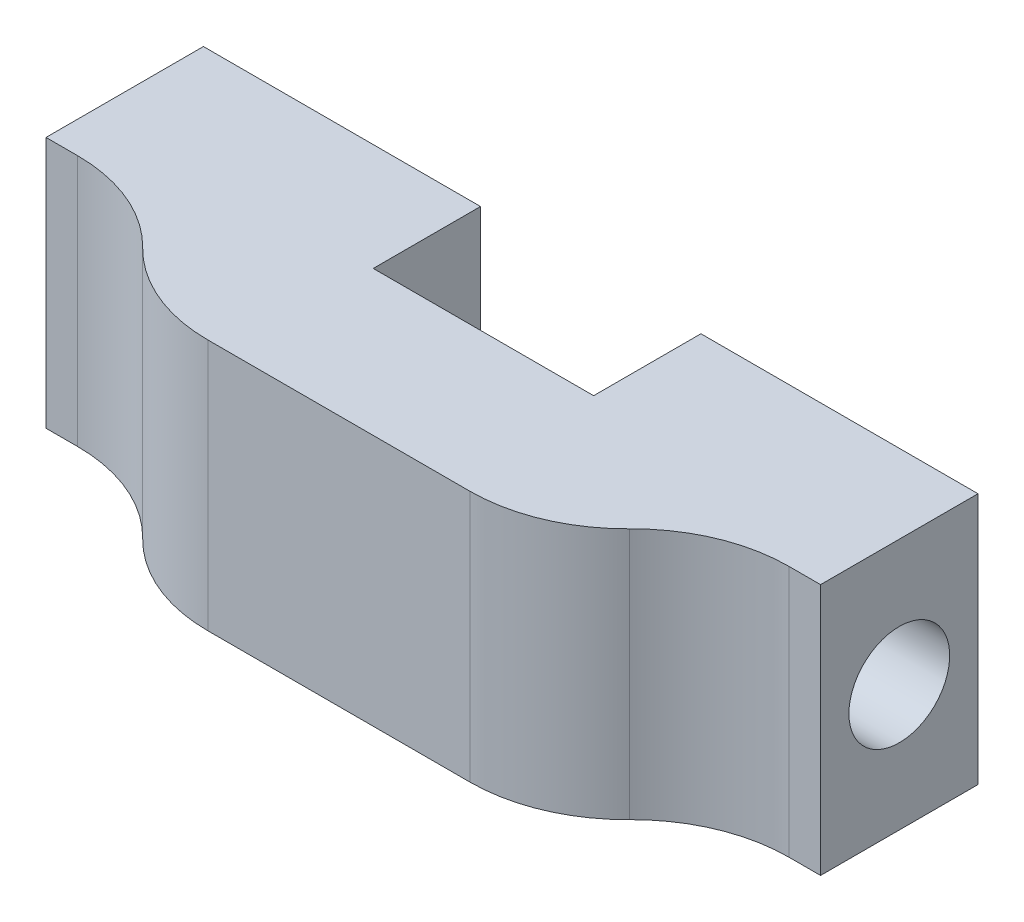
ISO-10303-21;
HEADER;
FILE_DESCRIPTION(('STEP AP214'),'2;1');
FILE_NAME('part.step','',(''),(''),'','','');
FILE_SCHEMA(('AUTOMOTIVE_DESIGN { 1 0 10303 214 1 1 1 1 }'));
ENDSEC;
DATA;
#1=APPLICATION_CONTEXT('core data for automotive mechanical design processes');
#2=APPLICATION_PROTOCOL_DEFINITION('international standard','automotive_design',2000,#1);
#3=PRODUCT_CONTEXT('',#1,'mechanical');
#4=PRODUCT('Part','Part','',(#3));
#5=PRODUCT_RELATED_PRODUCT_CATEGORY('part','',(#4));
#6=PRODUCT_DEFINITION_FORMATION('','',#4);
#7=PRODUCT_DEFINITION_CONTEXT('part definition',#1,'design');
#8=PRODUCT_DEFINITION('design','',#6,#7);
#9=PRODUCT_DEFINITION_SHAPE('','',#8);
#10=(LENGTH_UNIT() NAMED_UNIT(*) SI_UNIT(.MILLI.,.METRE.));
#11=(NAMED_UNIT(*) PLANE_ANGLE_UNIT() SI_UNIT($,.RADIAN.));
#12=(NAMED_UNIT(*) SI_UNIT($,.STERADIAN.) SOLID_ANGLE_UNIT());
#13=UNCERTAINTY_MEASURE_WITH_UNIT(LENGTH_MEASURE(1.E-05),#10,'distance_accuracy_value','');
#14=(GEOMETRIC_REPRESENTATION_CONTEXT(3) GLOBAL_UNCERTAINTY_ASSIGNED_CONTEXT((#13)) GLOBAL_UNIT_ASSIGNED_CONTEXT((#10,
#11,#12)) REPRESENTATION_CONTEXT('',''));
#15=CARTESIAN_POINT('',(0.,0.,0.));
#16=DIRECTION('',(0.,0.,1.));
#17=DIRECTION('',(1.,0.,0.));
#18=AXIS2_PLACEMENT_3D('',#15,#16,#17);
#19=CARTESIAN_POINT('',(4.15857157145715,4.,2.99999999999946));
#20=DIRECTION('',(0.,-1.,0.));
#21=DIRECTION('',(0.,0.,-1.));
#22=AXIS2_PLACEMENT_3D('',#19,#20,#21);
#23=CYLINDRICAL_SURFACE('',#22,5.);
#24=CARTESIAN_POINT('',(4.15857157145715,-4.,2.99999999999946));
#25=DIRECTION('',(0.,1.,0.));
#26=DIRECTION('',(0.,0.,1.));
#27=AXIS2_PLACEMENT_3D('',#24,#25,#26);
#28=CIRCLE('',#27,5.);
#29=CARTESIAN_POINT('',(4.15857157145716,-4.,7.99999999999945));
#30=VERTEX_POINT('',#29);
#31=CARTESIAN_POINT('',(7.72928578572858,-4.,6.49999999999946));
#32=VERTEX_POINT('',#31);
#33=EDGE_CURVE('E242',#30,#32,#28,.T.);
#34=ORIENTED_EDGE('',*,*,#33,.T.);
#35=DIRECTION('',(0.,-1.,0.));
#36=VECTOR('',#35,1.);
#37=CARTESIAN_POINT('',(7.72928578572858,4.,6.49999999999946));
#38=LINE('',#37,#36);
#39=CARTESIAN_POINT('',(7.72928578572858,4.,6.49999999999946));
#40=VERTEX_POINT('',#39);
#41=EDGE_CURVE('E48',#40,#32,#38,.T.);
#42=ORIENTED_EDGE('',*,*,#41,.F.);
#43=CARTESIAN_POINT('',(4.15857157145715,4.,2.99999999999946));
#44=DIRECTION('',(0.,1.,0.));
#45=DIRECTION('',(0.,0.,1.));
#46=AXIS2_PLACEMENT_3D('',#43,#44,#45);
#47=CIRCLE('',#46,5.);
#48=CARTESIAN_POINT('',(4.15857157145716,4.,7.99999999999945));
#49=VERTEX_POINT('',#48);
#50=EDGE_CURVE('E215',#49,#40,#47,.T.);
#51=ORIENTED_EDGE('',*,*,#50,.F.);
#52=DIRECTION('',(0.,-1.,0.));
#53=VECTOR('',#52,1.);
#54=CARTESIAN_POINT('',(4.15857157145716,4.,7.99999999999945));
#55=LINE('',#54,#53);
#56=EDGE_CURVE('E209',#49,#30,#55,.T.);
#57=ORIENTED_EDGE('',*,*,#56,.T.);
#58=EDGE_LOOP('',(#34,#42,#51,#57));
#59=FACE_BOUND('',#58,.T.);
#60=ADVANCED_FACE('F41',(#59),#23,.T.);
#61=CARTESIAN_POINT('',(11.3,4.,9.99999999999946));
#62=DIRECTION('',(0.,-1.,0.));
#63=DIRECTION('',(0.,0.,-1.));
#64=AXIS2_PLACEMENT_3D('',#61,#62,#63);
#65=CYLINDRICAL_SURFACE('',#64,5.00000000000001);
#66=CARTESIAN_POINT('',(11.3,-4.,9.99999999999946));
#67=DIRECTION('',(0.,1.,0.));
#68=DIRECTION('',(0.,0.,1.));
#69=AXIS2_PLACEMENT_3D('',#66,#67,#68);
#70=CIRCLE('',#69,5.00000000000001);
#71=CARTESIAN_POINT('',(11.3,-4.,4.99999999999945));
#72=VERTEX_POINT('',#71);
#73=EDGE_CURVE('E240',#32,#72,#70,.F.);
#74=ORIENTED_EDGE('',*,*,#73,.T.);
#75=DIRECTION('',(0.,-1.,0.));
#76=VECTOR('',#75,1.);
#77=CARTESIAN_POINT('',(11.3,4.,4.99999999999945));
#78=LINE('',#77,#76);
#79=CARTESIAN_POINT('',(11.3,4.,4.99999999999945));
#80=VERTEX_POINT('',#79);
#81=EDGE_CURVE('E310',#80,#72,#78,.T.);
#82=ORIENTED_EDGE('',*,*,#81,.F.);
#83=CARTESIAN_POINT('',(11.3,4.,9.99999999999946));
#84=DIRECTION('',(0.,1.,0.));
#85=DIRECTION('',(0.,0.,1.));
#86=AXIS2_PLACEMENT_3D('',#83,#84,#85);
#87=CIRCLE('',#86,5.00000000000001);
#88=EDGE_CURVE('E269',#40,#80,#87,.F.);
#89=ORIENTED_EDGE('',*,*,#88,.F.);
#90=ORIENTED_EDGE('',*,*,#41,.T.);
#91=EDGE_LOOP('',(#74,#82,#89,#90));
#92=FACE_BOUND('',#91,.T.);
#93=ADVANCED_FACE('F290',(#92),#65,.F.);
#94=CARTESIAN_POINT('',(0.,4.,4.99999999999945));
#95=DIRECTION('',(0.,0.,-1.));
#96=DIRECTION('',(-1.,0.,0.));
#97=AXIS2_PLACEMENT_3D('',#94,#95,#96);
#98=PLANE('',#97);
#99=DIRECTION('',(1.,0.,0.));
#100=VECTOR('',#99,1.);
#101=CARTESIAN_POINT('',(0.,-4.,4.99999999999945));
#102=LINE('',#101,#100);
#103=CARTESIAN_POINT('',(12.3,-4.,4.99999999999945));
#104=VERTEX_POINT('',#103);
#105=EDGE_CURVE('E238',#72,#104,#102,.T.);
#106=ORIENTED_EDGE('',*,*,#105,.T.);
#107=DIRECTION('',(0.,-1.,0.));
#108=VECTOR('',#107,1.);
#109=CARTESIAN_POINT('',(12.3,4.,4.99999999999945));
#110=LINE('',#109,#108);
#111=CARTESIAN_POINT('',(12.3,4.,4.99999999999945));
#112=VERTEX_POINT('',#111);
#113=EDGE_CURVE('E311',#112,#104,#110,.T.);
#114=ORIENTED_EDGE('',*,*,#113,.F.);
#115=DIRECTION('',(1.,0.,0.));
#116=VECTOR('',#115,1.);
#117=CARTESIAN_POINT('',(0.,4.,4.99999999999945));
#118=LINE('',#117,#116);
#119=EDGE_CURVE('E267',#80,#112,#118,.T.);
#120=ORIENTED_EDGE('',*,*,#119,.F.);
#121=ORIENTED_EDGE('',*,*,#81,.T.);
#122=EDGE_LOOP('',(#106,#114,#120,#121));
#123=FACE_BOUND('',#122,.T.);
#124=ADVANCED_FACE('F295',(#123),#98,.F.);
#125=CARTESIAN_POINT('',(12.3,4.,0.));
#126=DIRECTION('',(-1.,0.,0.));
#127=DIRECTION('',(0.,0.,1.));
#128=AXIS2_PLACEMENT_3D('',#125,#126,#127);
#129=PLANE('',#128);
#130=CARTESIAN_POINT('',(12.3,0.,2.49999999999972));
#131=DIRECTION('',(-1.,0.,0.));
#132=DIRECTION('',(0.,0.,1.));
#133=AXIS2_PLACEMENT_3D('',#130,#131,#132);
#134=CIRCLE('',#133,1.6);
#135=CARTESIAN_POINT('',(12.3,0.,4.09999999999972));
#136=VERTEX_POINT('',#135);
#137=EDGE_CURVE('E171',#136,#136,#134,.T.);
#138=ORIENTED_EDGE('',*,*,#137,.T.);
#139=EDGE_LOOP('',(#138));
#140=FACE_BOUND('',#139,.T.);
#141=DIRECTION('',(0.,0.,-1.));
#142=VECTOR('',#141,1.);
#143=CARTESIAN_POINT('',(12.3,-4.,0.));
#144=LINE('',#143,#142);
#145=CARTESIAN_POINT('',(12.3,-4.,0.));
#146=VERTEX_POINT('',#145);
#147=EDGE_CURVE('E236',#104,#146,#144,.T.);
#148=ORIENTED_EDGE('',*,*,#147,.T.);
#149=DIRECTION('',(0.,-1.,0.));
#150=VECTOR('',#149,1.);
#151=CARTESIAN_POINT('',(12.3,4.,0.));
#152=LINE('',#151,#150);
#153=CARTESIAN_POINT('',(12.3,4.,0.));
#154=VERTEX_POINT('',#153);
#155=EDGE_CURVE('E178',#154,#146,#152,.T.);
#156=ORIENTED_EDGE('',*,*,#155,.F.);
#157=DIRECTION('',(0.,0.,-1.));
#158=VECTOR('',#157,1.);
#159=CARTESIAN_POINT('',(12.3,4.,0.));
#160=LINE('',#159,#158);
#161=EDGE_CURVE('E265',#112,#154,#160,.T.);
#162=ORIENTED_EDGE('',*,*,#161,.F.);
#163=ORIENTED_EDGE('',*,*,#113,.T.);
#164=EDGE_LOOP('',(#148,#156,#162,#163));
#165=FACE_BOUND('',#164,.T.);
#166=ADVANCED_FACE('F280',(#140,#165),#129,.F.);
#167=CARTESIAN_POINT('',(0.,4.,0.));
#168=DIRECTION('',(0.,0.,1.));
#169=DIRECTION('',(1.,0.,0.));
#170=AXIS2_PLACEMENT_3D('',#167,#168,#169);
#171=PLANE('',#170);
#172=DIRECTION('',(-1.,0.,0.));
#173=VECTOR('',#172,1.);
#174=CARTESIAN_POINT('',(0.,-4.,0.));
#175=LINE('',#174,#173);
#176=CARTESIAN_POINT('',(3.5,-4.,0.));
#177=VERTEX_POINT('',#176);
#178=EDGE_CURVE('E234',#146,#177,#175,.T.);
#179=ORIENTED_EDGE('',*,*,#178,.T.);
#180=DIRECTION('',(0.,-1.,0.));
#181=VECTOR('',#180,1.);
#182=CARTESIAN_POINT('',(3.5,4.,0.));
#183=LINE('',#182,#181);
#184=CARTESIAN_POINT('',(3.5,4.,0.));
#185=VERTEX_POINT('',#184);
#186=EDGE_CURVE('E176',#185,#177,#183,.T.);
#187=ORIENTED_EDGE('',*,*,#186,.F.);
#188=DIRECTION('',(-1.,0.,0.));
#189=VECTOR('',#188,1.);
#190=CARTESIAN_POINT('',(0.,4.,0.));
#191=LINE('',#190,#189);
#192=EDGE_CURVE('E263',#154,#185,#191,.T.);
#193=ORIENTED_EDGE('',*,*,#192,.F.);
#194=ORIENTED_EDGE('',*,*,#155,.T.);
#195=EDGE_LOOP('',(#179,#187,#193,#194));
#196=FACE_BOUND('',#195,.T.);
#197=ADVANCED_FACE('F321',(#196),#171,.F.);
#198=CARTESIAN_POINT('',(3.5,4.,0.));
#199=DIRECTION('',(1.,0.,0.));
#200=DIRECTION('',(0.,0.,-1.));
#201=AXIS2_PLACEMENT_3D('',#198,#199,#200);
#202=PLANE('',#201);
#203=DIRECTION('',(0.,-1.,0.));
#204=VECTOR('',#203,1.);
#205=CARTESIAN_POINT('',(3.5,4.,3.40719730754273));
#206=LINE('',#205,#204);
#207=CARTESIAN_POINT('',(3.5,-1.31795031969597,3.40719730754273));
#208=VERTEX_POINT('',#207);
#209=CARTESIAN_POINT('',(3.5,-4.,3.40719730754273));
#210=VERTEX_POINT('',#209);
#211=EDGE_CURVE('E160',#208,#210,#206,.T.);
#212=ORIENTED_EDGE('',*,*,#211,.F.);
#213=CARTESIAN_POINT('',(3.5,0.,2.49999999999972));
#214=DIRECTION('',(-1.,0.,0.));
#215=DIRECTION('',(0.,0.,1.));
#216=AXIS2_PLACEMENT_3D('',#213,#214,#215);
#217=CIRCLE('',#216,1.6);
#218=CARTESIAN_POINT('',(3.5,1.31795031969597,3.40719730754273));
#219=VERTEX_POINT('',#218);
#220=EDGE_CURVE('E54',#219,#208,#217,.T.);
#221=ORIENTED_EDGE('',*,*,#220,.F.);
#222=CARTESIAN_POINT('',(3.5,4.,3.40719730754273));
#223=VERTEX_POINT('',#222);
#224=EDGE_CURVE('E159',#223,#219,#206,.T.);
#225=ORIENTED_EDGE('',*,*,#224,.F.);
#226=DIRECTION('',(0.,0.,1.));
#227=VECTOR('',#226,1.);
#228=CARTESIAN_POINT('',(3.5,4.,0.));
#229=LINE('',#228,#227);
#230=EDGE_CURVE('E261',#185,#223,#229,.T.);
#231=ORIENTED_EDGE('',*,*,#230,.F.);
#232=ORIENTED_EDGE('',*,*,#186,.T.);
#233=DIRECTION('',(0.,0.,1.));
#234=VECTOR('',#233,1.);
#235=CARTESIAN_POINT('',(3.5,-4.,0.));
#236=LINE('',#235,#234);
#237=EDGE_CURVE('E232',#177,#210,#236,.T.);
#238=ORIENTED_EDGE('',*,*,#237,.T.);
#239=EDGE_LOOP('',(#212,#221,#225,#231,#232,#238));
#240=FACE_BOUND('',#239,.T.);
#241=ADVANCED_FACE('F167',(#240),#202,.F.);
#242=CARTESIAN_POINT('',(0.,4.,3.40719730754273));
#243=DIRECTION('',(0.,0.,1.));
#244=DIRECTION('',(1.,0.,0.));
#245=AXIS2_PLACEMENT_3D('',#242,#243,#244);
#246=PLANE('',#245);
#247=DIRECTION('',(-1.,0.,0.));
#248=VECTOR('',#247,1.);
#249=CARTESIAN_POINT('',(0.,-4.,3.40719730754273));
#250=LINE('',#249,#248);
#251=CARTESIAN_POINT('',(-3.5,-4.,3.40719730754273));
#252=VERTEX_POINT('',#251);
#253=EDGE_CURVE('E230',#210,#252,#250,.T.);
#254=ORIENTED_EDGE('',*,*,#253,.T.);
#255=DIRECTION('',(0.,-1.,0.));
#256=VECTOR('',#255,1.);
#257=CARTESIAN_POINT('',(-3.5,4.,3.40719730754273));
#258=LINE('',#257,#256);
#259=CARTESIAN_POINT('',(-3.5,-1.31795031969597,3.40719730754273));
#260=VERTEX_POINT('',#259);
#261=EDGE_CURVE('E184',#260,#252,#258,.T.);
#262=ORIENTED_EDGE('',*,*,#261,.F.);
#263=CARTESIAN_POINT('',(-3.5,1.31795031969597,3.40719730754273));
#264=VERTEX_POINT('',#263);
#265=EDGE_CURVE('E183',#264,#260,#258,.T.);
#266=ORIENTED_EDGE('',*,*,#265,.F.);
#267=CARTESIAN_POINT('',(-3.5,4.,3.40719730754273));
#268=VERTEX_POINT('',#267);
#269=EDGE_CURVE('E181',#268,#264,#258,.T.);
#270=ORIENTED_EDGE('',*,*,#269,.F.);
#271=DIRECTION('',(-1.,0.,0.));
#272=VECTOR('',#271,1.);
#273=CARTESIAN_POINT('',(0.,4.,3.40719730754273));
#274=LINE('',#273,#272);
#275=EDGE_CURVE('E175',#223,#268,#274,.T.);
#276=ORIENTED_EDGE('',*,*,#275,.F.);
#277=ORIENTED_EDGE('',*,*,#224,.T.);
#278=EDGE_CURVE('E153',#219,#208,#206,.T.);
#279=ORIENTED_EDGE('',*,*,#278,.T.);
#280=ORIENTED_EDGE('',*,*,#211,.T.);
#281=EDGE_LOOP('',(#254,#262,#266,#270,#276,#277,#279,#280));
#282=FACE_BOUND('',#281,.T.);
#283=ADVANCED_FACE('F173',(#282),#246,.F.);
#284=CARTESIAN_POINT('',(-3.5,4.,0.));
#285=DIRECTION('',(-1.,0.,0.));
#286=DIRECTION('',(0.,0.,1.));
#287=AXIS2_PLACEMENT_3D('',#284,#285,#286);
#288=PLANE('',#287);
#289=ORIENTED_EDGE('',*,*,#269,.T.);
#290=CARTESIAN_POINT('',(-3.5,0.,2.49999999999972));
#291=DIRECTION('',(-1.,0.,0.));
#292=DIRECTION('',(0.,0.,1.));
#293=AXIS2_PLACEMENT_3D('',#290,#291,#292);
#294=CIRCLE('',#293,1.6);
#295=EDGE_CURVE('E11',#264,#260,#294,.T.);
#296=ORIENTED_EDGE('',*,*,#295,.T.);
#297=ORIENTED_EDGE('',*,*,#261,.T.);
#298=DIRECTION('',(0.,0.,-1.));
#299=VECTOR('',#298,1.);
#300=CARTESIAN_POINT('',(-3.5,-4.,0.));
#301=LINE('',#300,#299);
#302=CARTESIAN_POINT('',(-3.5,-4.,0.));
#303=VERTEX_POINT('',#302);
#304=EDGE_CURVE('E228',#252,#303,#301,.T.);
#305=ORIENTED_EDGE('',*,*,#304,.T.);
#306=DIRECTION('',(0.,-1.,0.));
#307=VECTOR('',#306,1.);
#308=CARTESIAN_POINT('',(-3.5,4.,0.));
#309=LINE('',#308,#307);
#310=CARTESIAN_POINT('',(-3.5,4.,0.));
#311=VERTEX_POINT('',#310);
#312=EDGE_CURVE('E188',#311,#303,#309,.T.);
#313=ORIENTED_EDGE('',*,*,#312,.F.);
#314=DIRECTION('',(0.,0.,-1.));
#315=VECTOR('',#314,1.);
#316=CARTESIAN_POINT('',(-3.5,4.,0.));
#317=LINE('',#316,#315);
#318=EDGE_CURVE('E258',#268,#311,#317,.T.);
#319=ORIENTED_EDGE('',*,*,#318,.F.);
#320=EDGE_LOOP('',(#289,#296,#297,#305,#313,#319));
#321=FACE_BOUND('',#320,.T.);
#322=ADVANCED_FACE('F345',(#321),#288,.F.);
#323=CARTESIAN_POINT('',(0.,4.,0.));
#324=DIRECTION('',(0.,0.,1.));
#325=DIRECTION('',(1.,0.,0.));
#326=AXIS2_PLACEMENT_3D('',#323,#324,#325);
#327=PLANE('',#326);
#328=DIRECTION('',(-1.,0.,0.));
#329=VECTOR('',#328,1.);
#330=CARTESIAN_POINT('',(0.,-4.,0.));
#331=LINE('',#330,#329);
#332=CARTESIAN_POINT('',(-12.3,-4.,0.));
#333=VERTEX_POINT('',#332);
#334=EDGE_CURVE('E226',#303,#333,#331,.T.);
#335=ORIENTED_EDGE('',*,*,#334,.T.);
#336=DIRECTION('',(0.,-1.,0.));
#337=VECTOR('',#336,1.);
#338=CARTESIAN_POINT('',(-12.3,4.,0.));
#339=LINE('',#338,#337);
#340=CARTESIAN_POINT('',(-12.3,4.,0.));
#341=VERTEX_POINT('',#340);
#342=EDGE_CURVE('E191',#341,#333,#339,.T.);
#343=ORIENTED_EDGE('',*,*,#342,.F.);
#344=DIRECTION('',(-1.,0.,0.));
#345=VECTOR('',#344,1.);
#346=CARTESIAN_POINT('',(0.,4.,0.));
#347=LINE('',#346,#345);
#348=EDGE_CURVE('E256',#311,#341,#347,.T.);
#349=ORIENTED_EDGE('',*,*,#348,.F.);
#350=ORIENTED_EDGE('',*,*,#312,.T.);
#351=EDGE_LOOP('',(#335,#343,#349,#350));
#352=FACE_BOUND('',#351,.T.);
#353=ADVANCED_FACE('F348',(#352),#327,.F.);
#354=CARTESIAN_POINT('',(-12.3,4.,0.));
#355=DIRECTION('',(-1.,0.,0.));
#356=DIRECTION('',(0.,0.,1.));
#357=AXIS2_PLACEMENT_3D('',#354,#355,#356);
#358=PLANE('',#357);
#359=CARTESIAN_POINT('',(-12.3,0.,2.49999999999972));
#360=DIRECTION('',(-1.,0.,0.));
#361=DIRECTION('',(0.,0.,1.));
#362=AXIS2_PLACEMENT_3D('',#359,#360,#361);
#363=CIRCLE('',#362,1.6);
#364=CARTESIAN_POINT('',(-12.3,0.,4.09999999999972));
#365=VERTEX_POINT('',#364);
#366=EDGE_CURVE('E274',#365,#365,#363,.T.);
#367=ORIENTED_EDGE('',*,*,#366,.F.);
#368=EDGE_LOOP('',(#367));
#369=FACE_BOUND('',#368,.T.);
#370=DIRECTION('',(0.,0.,-1.));
#371=VECTOR('',#370,1.);
#372=CARTESIAN_POINT('',(-12.3,-4.,0.));
#373=LINE('',#372,#371);
#374=CARTESIAN_POINT('',(-12.3,-4.,4.99999999999945));
#375=VERTEX_POINT('',#374);
#376=EDGE_CURVE('E223',#375,#333,#373,.T.);
#377=ORIENTED_EDGE('',*,*,#376,.F.);
#378=DIRECTION('',(0.,-1.,0.));
#379=VECTOR('',#378,1.);
#380=CARTESIAN_POINT('',(-12.3,4.,4.99999999999945));
#381=LINE('',#380,#379);
#382=CARTESIAN_POINT('',(-12.3,4.,4.99999999999945));
#383=VERTEX_POINT('',#382);
#384=EDGE_CURVE('E197',#383,#375,#381,.T.);
#385=ORIENTED_EDGE('',*,*,#384,.F.);
#386=DIRECTION('',(0.,0.,-1.));
#387=VECTOR('',#386,1.);
#388=CARTESIAN_POINT('',(-12.3,4.,0.));
#389=LINE('',#388,#387);
#390=EDGE_CURVE('E253',#383,#341,#389,.T.);
#391=ORIENTED_EDGE('',*,*,#390,.T.);
#392=ORIENTED_EDGE('',*,*,#342,.T.);
#393=EDGE_LOOP('',(#377,#385,#391,#392));
#394=FACE_BOUND('',#393,.T.);
#395=ADVANCED_FACE('F351',(#369,#394),#358,.T.);
#396=CARTESIAN_POINT('',(0.,4.,4.99999999999945));
#397=DIRECTION('',(0.,0.,1.));
#398=DIRECTION('',(1.,0.,0.));
#399=AXIS2_PLACEMENT_3D('',#396,#397,#398);
#400=PLANE('',#399);
#401=DIRECTION('',(-1.,0.,0.));
#402=VECTOR('',#401,1.);
#403=CARTESIAN_POINT('',(0.,-4.,4.99999999999945));
#404=LINE('',#403,#402);
#405=CARTESIAN_POINT('',(-11.3,-4.,4.99999999999945));
#406=VERTEX_POINT('',#405);
#407=EDGE_CURVE('E220',#406,#375,#404,.T.);
#408=ORIENTED_EDGE('',*,*,#407,.F.);
#409=DIRECTION('',(0.,-1.,0.));
#410=VECTOR('',#409,1.);
#411=CARTESIAN_POINT('',(-11.3,4.,4.99999999999945));
#412=LINE('',#411,#410);
#413=CARTESIAN_POINT('',(-11.3,4.,4.99999999999945));
#414=VERTEX_POINT('',#413);
#415=EDGE_CURVE('E201',#414,#406,#412,.T.);
#416=ORIENTED_EDGE('',*,*,#415,.F.);
#417=DIRECTION('',(-1.,0.,0.));
#418=VECTOR('',#417,1.);
#419=CARTESIAN_POINT('',(0.,4.,4.99999999999945));
#420=LINE('',#419,#418);
#421=EDGE_CURVE('E250',#414,#383,#420,.T.);
#422=ORIENTED_EDGE('',*,*,#421,.T.);
#423=ORIENTED_EDGE('',*,*,#384,.T.);
#424=EDGE_LOOP('',(#408,#416,#422,#423));
#425=FACE_BOUND('',#424,.T.);
#426=ADVANCED_FACE('F354',(#425),#400,.T.);
#427=CARTESIAN_POINT('',(-11.3,4.,9.99999999999946));
#428=DIRECTION('',(0.,-1.,0.));
#429=DIRECTION('',(0.,0.,-1.));
#430=AXIS2_PLACEMENT_3D('',#427,#428,#429);
#431=CYLINDRICAL_SURFACE('',#430,5.00000000000001);
#432=CARTESIAN_POINT('',(-11.3,-4.,9.99999999999946));
#433=DIRECTION('',(0.,1.,0.));
#434=DIRECTION('',(0.,0.,1.));
#435=AXIS2_PLACEMENT_3D('',#432,#433,#434);
#436=CIRCLE('',#435,5.00000000000001);
#437=CARTESIAN_POINT('',(-7.72928578572857,-4.,6.49999999999946));
#438=VERTEX_POINT('',#437);
#439=EDGE_CURVE('E218',#406,#438,#436,.F.);
#440=ORIENTED_EDGE('',*,*,#439,.T.);
#441=DIRECTION('',(0.,-1.,0.));
#442=VECTOR('',#441,1.);
#443=CARTESIAN_POINT('',(-7.72928578572857,4.,6.49999999999946));
#444=LINE('',#443,#442);
#445=CARTESIAN_POINT('',(-7.72928578572857,4.,6.49999999999946));
#446=VERTEX_POINT('',#445);
#447=EDGE_CURVE('E203',#446,#438,#444,.T.);
#448=ORIENTED_EDGE('',*,*,#447,.F.);
#449=CARTESIAN_POINT('',(-11.3,4.,9.99999999999946));
#450=DIRECTION('',(0.,1.,0.));
#451=DIRECTION('',(0.,0.,1.));
#452=AXIS2_PLACEMENT_3D('',#449,#450,#451);
#453=CIRCLE('',#452,5.00000000000001);
#454=EDGE_CURVE('E248',#414,#446,#453,.F.);
#455=ORIENTED_EDGE('',*,*,#454,.F.);
#456=ORIENTED_EDGE('',*,*,#415,.T.);
#457=EDGE_LOOP('',(#440,#448,#455,#456));
#458=FACE_BOUND('',#457,.T.);
#459=ADVANCED_FACE('F358',(#458),#431,.F.);
#460=CARTESIAN_POINT('',(-4.15857157145715,4.,2.99999999999946));
#461=DIRECTION('',(0.,-1.,0.));
#462=DIRECTION('',(0.,0.,-1.));
#463=AXIS2_PLACEMENT_3D('',#460,#461,#462);
#464=CYLINDRICAL_SURFACE('',#463,4.99999999999999);
#465=CARTESIAN_POINT('',(-4.15857157145715,-4.,2.99999999999946));
#466=DIRECTION('',(0.,1.,0.));
#467=DIRECTION('',(0.,0.,1.));
#468=AXIS2_PLACEMENT_3D('',#465,#466,#467);
#469=CIRCLE('',#468,4.99999999999999);
#470=CARTESIAN_POINT('',(-4.15857157145716,-4.,7.99999999999945));
#471=VERTEX_POINT('',#470);
#472=EDGE_CURVE('E216',#438,#471,#469,.T.);
#473=ORIENTED_EDGE('',*,*,#472,.T.);
#474=DIRECTION('',(0.,-1.,0.));
#475=VECTOR('',#474,1.);
#476=CARTESIAN_POINT('',(-4.15857157145716,4.,7.99999999999945));
#477=LINE('',#476,#475);
#478=CARTESIAN_POINT('',(-4.15857157145716,4.,7.99999999999945));
#479=VERTEX_POINT('',#478);
#480=EDGE_CURVE('E206',#479,#471,#477,.T.);
#481=ORIENTED_EDGE('',*,*,#480,.F.);
#482=CARTESIAN_POINT('',(-4.15857157145715,4.,2.99999999999946));
#483=DIRECTION('',(0.,1.,0.));
#484=DIRECTION('',(0.,0.,1.));
#485=AXIS2_PLACEMENT_3D('',#482,#483,#484);
#486=CIRCLE('',#485,4.99999999999999);
#487=EDGE_CURVE('E246',#446,#479,#486,.T.);
#488=ORIENTED_EDGE('',*,*,#487,.F.);
#489=ORIENTED_EDGE('',*,*,#447,.T.);
#490=EDGE_LOOP('',(#473,#481,#488,#489));
#491=FACE_BOUND('',#490,.T.);
#492=ADVANCED_FACE('F362',(#491),#464,.T.);
#493=CARTESIAN_POINT('',(0.,4.,7.99999999999945));
#494=DIRECTION('',(0.,0.,-1.));
#495=DIRECTION('',(-1.,0.,0.));
#496=AXIS2_PLACEMENT_3D('',#493,#494,#495);
#497=PLANE('',#496);
#498=DIRECTION('',(1.,0.,0.));
#499=VECTOR('',#498,1.);
#500=CARTESIAN_POINT('',(0.,-4.,7.99999999999945));
#501=LINE('',#500,#499);
#502=EDGE_CURVE('E213',#471,#30,#501,.T.);
#503=ORIENTED_EDGE('',*,*,#502,.T.);
#504=ORIENTED_EDGE('',*,*,#56,.F.);
#505=DIRECTION('',(1.,0.,0.));
#506=VECTOR('',#505,1.);
#507=CARTESIAN_POINT('',(0.,4.,7.99999999999945));
#508=LINE('',#507,#506);
#509=EDGE_CURVE('E212',#479,#49,#508,.T.);
#510=ORIENTED_EDGE('',*,*,#509,.F.);
#511=ORIENTED_EDGE('',*,*,#480,.T.);
#512=EDGE_LOOP('',(#503,#504,#510,#511));
#513=FACE_BOUND('',#512,.T.);
#514=ADVANCED_FACE('F366',(#513),#497,.F.);
#515=CARTESIAN_POINT('',(0.,4.,0.));
#516=DIRECTION('',(0.,1.,0.));
#517=DIRECTION('',(0.,0.,1.));
#518=AXIS2_PLACEMENT_3D('',#515,#516,#517);
#519=PLANE('',#518);
#520=ORIENTED_EDGE('',*,*,#50,.T.);
#521=ORIENTED_EDGE('',*,*,#88,.T.);
#522=ORIENTED_EDGE('',*,*,#119,.T.);
#523=ORIENTED_EDGE('',*,*,#161,.T.);
#524=ORIENTED_EDGE('',*,*,#192,.T.);
#525=ORIENTED_EDGE('',*,*,#230,.T.);
#526=ORIENTED_EDGE('',*,*,#275,.T.);
#527=ORIENTED_EDGE('',*,*,#318,.T.);
#528=ORIENTED_EDGE('',*,*,#348,.T.);
#529=ORIENTED_EDGE('',*,*,#390,.F.);
#530=ORIENTED_EDGE('',*,*,#421,.F.);
#531=ORIENTED_EDGE('',*,*,#454,.T.);
#532=ORIENTED_EDGE('',*,*,#487,.T.);
#533=ORIENTED_EDGE('',*,*,#509,.T.);
#534=EDGE_LOOP('',(#520,#521,#522,#523,#524,#525,#526,#527,#528,#529,#530,#531,#532,#533));
#535=FACE_BOUND('',#534,.T.);
#536=ADVANCED_FACE('F328',(#535),#519,.T.);
#537=CARTESIAN_POINT('',(0.,-4.,0.));
#538=DIRECTION('',(0.,1.,0.));
#539=DIRECTION('',(0.,0.,1.));
#540=AXIS2_PLACEMENT_3D('',#537,#538,#539);
#541=PLANE('',#540);
#542=ORIENTED_EDGE('',*,*,#33,.F.);
#543=ORIENTED_EDGE('',*,*,#502,.F.);
#544=ORIENTED_EDGE('',*,*,#472,.F.);
#545=ORIENTED_EDGE('',*,*,#439,.F.);
#546=ORIENTED_EDGE('',*,*,#407,.T.);
#547=ORIENTED_EDGE('',*,*,#376,.T.);
#548=ORIENTED_EDGE('',*,*,#334,.F.);
#549=ORIENTED_EDGE('',*,*,#304,.F.);
#550=ORIENTED_EDGE('',*,*,#253,.F.);
#551=ORIENTED_EDGE('',*,*,#237,.F.);
#552=ORIENTED_EDGE('',*,*,#178,.F.);
#553=ORIENTED_EDGE('',*,*,#147,.F.);
#554=ORIENTED_EDGE('',*,*,#105,.F.);
#555=ORIENTED_EDGE('',*,*,#73,.F.);
#556=EDGE_LOOP('',(#542,#543,#544,#545,#546,#547,#548,#549,#550,#551,#552,#553,#554,#555));
#557=FACE_BOUND('',#556,.T.);
#558=ADVANCED_FACE('F304',(#557),#541,.F.);
#559=CARTESIAN_POINT('',(-3.5,4.,0.));
#560=DIRECTION('',(-1.,0.,0.));
#561=DIRECTION('',(0.,0.,1.));
#562=AXIS2_PLACEMENT_3D('',#559,#560,#561);
#563=PLANE('',#562);
#564=ORIENTED_EDGE('',*,*,#265,.T.);
#565=CARTESIAN_POINT('',(-3.5,0.,2.49999999999972));
#566=DIRECTION('',(-1.,0.,0.));
#567=DIRECTION('',(0.,0.,1.));
#568=AXIS2_PLACEMENT_3D('',#565,#566,#567);
#569=CIRCLE('',#568,1.6);
#570=EDGE_CURVE('E61',#264,#260,#569,.F.);
#571=ORIENTED_EDGE('',*,*,#570,.F.);
#572=EDGE_LOOP('',(#564,#571));
#573=FACE_BOUND('',#572,.T.);
#574=ADVANCED_FACE('F373',(#573),#563,.T.);
#575=CARTESIAN_POINT('',(-12.3,0.,2.49999999999972));
#576=DIRECTION('',(-1.,0.,0.));
#577=DIRECTION('',(0.,0.,1.));
#578=AXIS2_PLACEMENT_3D('',#575,#576,#577);
#579=CYLINDRICAL_SURFACE('',#578,1.6);
#580=ORIENTED_EDGE('',*,*,#570,.T.);
#581=ORIENTED_EDGE('',*,*,#295,.F.);
#582=EDGE_LOOP('',(#580,#581));
#583=FACE_BOUND('',#582,.T.);
#584=ORIENTED_EDGE('',*,*,#366,.T.);
#585=EDGE_LOOP('',(#584));
#586=FACE_BOUND('',#585,.T.);
#587=ADVANCED_FACE('F287',(#583,#586),#579,.F.);
#588=CARTESIAN_POINT('',(3.5,4.,0.));
#589=DIRECTION('',(1.,0.,0.));
#590=DIRECTION('',(0.,0.,1.));
#591=AXIS2_PLACEMENT_3D('',#588,#589,#590);
#592=PLANE('',#591);
#593=ORIENTED_EDGE('',*,*,#278,.F.);
#594=EDGE_CURVE('E155',#208,#219,#217,.T.);
#595=ORIENTED_EDGE('',*,*,#594,.F.);
#596=EDGE_LOOP('',(#593,#595));
#597=FACE_BOUND('',#596,.T.);
#598=ADVANCED_FACE('F154',(#597),#592,.T.);
#599=CARTESIAN_POINT('',(12.3,0.,2.49999999999972));
#600=DIRECTION('',(1.,0.,0.));
#601=DIRECTION('',(0.,0.,1.));
#602=AXIS2_PLACEMENT_3D('',#599,#600,#601);
#603=CYLINDRICAL_SURFACE('',#602,1.6);
#604=ORIENTED_EDGE('',*,*,#220,.T.);
#605=ORIENTED_EDGE('',*,*,#594,.T.);
#606=EDGE_LOOP('',(#604,#605));
#607=FACE_BOUND('',#606,.T.);
#608=ORIENTED_EDGE('',*,*,#137,.F.);
#609=EDGE_LOOP('',(#608));
#610=FACE_BOUND('',#609,.T.);
#611=ADVANCED_FACE('F162',(#607,#610),#603,.F.);
#612=CLOSED_SHELL('',(#60,#93,#124,#166,#197,#241,#283,#322,#353,#395,#426,#459,#492,#514,#536,
#558,#574,#587,#598,#611));
#613=MANIFOLD_SOLID_BREP('B2',#612);
#614=ADVANCED_BREP_SHAPE_REPRESENTATION('',(#18,#613),#14);
#615=SHAPE_DEFINITION_REPRESENTATION(#9,#614);
ENDSEC;
END-ISO-10303-21;
